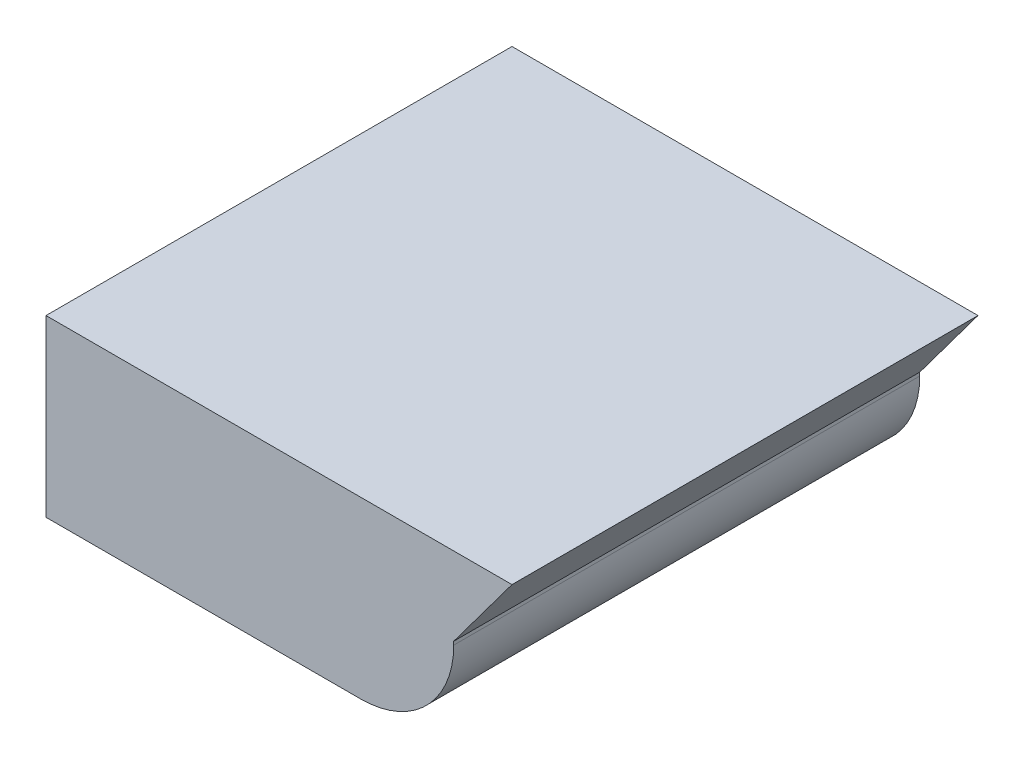
ISO-10303-21;
HEADER;
FILE_DESCRIPTION(('STEP AP214'),'2;1');
FILE_NAME('part.step','',(''),(''),'','','');
FILE_SCHEMA(('AUTOMOTIVE_DESIGN { 1 0 10303 214 1 1 1 1 }'));
ENDSEC;
DATA;
#1=APPLICATION_CONTEXT('core data for automotive mechanical design processes');
#2=APPLICATION_PROTOCOL_DEFINITION('international standard','automotive_design',2000,#1);
#3=PRODUCT_CONTEXT('',#1,'mechanical');
#4=PRODUCT('Part','Part','',(#3));
#5=PRODUCT_RELATED_PRODUCT_CATEGORY('part','',(#4));
#6=PRODUCT_DEFINITION_FORMATION('','',#4);
#7=PRODUCT_DEFINITION_CONTEXT('part definition',#1,'design');
#8=PRODUCT_DEFINITION('design','',#6,#7);
#9=PRODUCT_DEFINITION_SHAPE('','',#8);
#10=(LENGTH_UNIT() NAMED_UNIT(*) SI_UNIT(.MILLI.,.METRE.));
#11=(NAMED_UNIT(*) PLANE_ANGLE_UNIT() SI_UNIT($,.RADIAN.));
#12=(NAMED_UNIT(*) SI_UNIT($,.STERADIAN.) SOLID_ANGLE_UNIT());
#13=UNCERTAINTY_MEASURE_WITH_UNIT(LENGTH_MEASURE(1.E-05),#10,'distance_accuracy_value','');
#14=(GEOMETRIC_REPRESENTATION_CONTEXT(3) GLOBAL_UNCERTAINTY_ASSIGNED_CONTEXT((#13)) GLOBAL_UNIT_ASSIGNED_CONTEXT((#10,
#11,#12)) REPRESENTATION_CONTEXT('',''));
#15=CARTESIAN_POINT('',(0.,0.,0.));
#16=DIRECTION('',(0.,0.,1.));
#17=DIRECTION('',(1.,0.,0.));
#18=AXIS2_PLACEMENT_3D('',#15,#16,#17);
#19=CARTESIAN_POINT('',(13.2318514460255,-82.8660745039792,40.));
#20=DIRECTION('',(0.,0.,-1.));
#21=DIRECTION('',(-1.,0.,0.));
#22=AXIS2_PLACEMENT_3D('',#19,#20,#21);
#23=CYLINDRICAL_SURFACE('',#22,8.);
#24=DIRECTION('',(0.,0.,-1.));
#25=VECTOR('',#24,1.);
#26=CARTESIAN_POINT('',(21.2318514460255,-82.8660745039792,40.));
#27=LINE('',#26,#25);
#28=CARTESIAN_POINT('',(21.2318514460255,-82.8660745039792,40.));
#29=VERTEX_POINT('',#28);
#30=CARTESIAN_POINT('',(21.2318514460255,-82.8660745039792,0.));
#31=VERTEX_POINT('',#30);
#32=EDGE_CURVE('E116',#29,#31,#27,.T.);
#33=ORIENTED_EDGE('',*,*,#32,.F.);
#34=CARTESIAN_POINT('',(13.2318514460255,-82.8660745039792,40.));
#35=DIRECTION('',(0.,0.,-1.));
#36=DIRECTION('',(-1.,0.,0.));
#37=AXIS2_PLACEMENT_3D('',#34,#35,#36);
#38=CIRCLE('',#37,8.);
#39=CARTESIAN_POINT('',(13.2318514460255,-90.8660745039792,40.));
#40=VERTEX_POINT('',#39);
#41=EDGE_CURVE('E47',#40,#29,#38,.F.);
#42=ORIENTED_EDGE('',*,*,#41,.F.);
#43=DIRECTION('',(0.,0.,-1.));
#44=VECTOR('',#43,1.);
#45=CARTESIAN_POINT('',(13.2318514460255,-90.8660745039792,40.));
#46=LINE('',#45,#44);
#47=CARTESIAN_POINT('',(13.2318514460255,-90.8660745039792,0.));
#48=VERTEX_POINT('',#47);
#49=EDGE_CURVE('E96',#48,#40,#46,.F.);
#50=ORIENTED_EDGE('',*,*,#49,.F.);
#51=CARTESIAN_POINT('',(13.2318514460255,-82.8660745039792,0.));
#52=DIRECTION('',(0.,0.,-1.));
#53=DIRECTION('',(-1.,0.,0.));
#54=AXIS2_PLACEMENT_3D('',#51,#52,#53);
#55=CIRCLE('',#54,8.);
#56=EDGE_CURVE('E11',#31,#48,#55,.T.);
#57=ORIENTED_EDGE('',*,*,#56,.F.);
#58=EDGE_LOOP('',(#33,#42,#50,#57));
#59=FACE_BOUND('',#58,.T.);
#60=ADVANCED_FACE('F39',(#59),#23,.T.);
#61=CARTESIAN_POINT('',(-13.7681485539745,-90.8660745039792,40.));
#62=DIRECTION('',(1.,0.,0.));
#63=DIRECTION('',(0.,0.,-1.));
#64=AXIS2_PLACEMENT_3D('',#61,#62,#63);
#65=PLANE('',#64);
#66=DIRECTION('',(0.,-1.,0.));
#67=VECTOR('',#66,1.);
#68=CARTESIAN_POINT('',(-13.7681485539745,-90.8660745039792,0.));
#69=LINE('',#68,#67);
#70=CARTESIAN_POINT('',(-13.7681485539745,-75.8660745039792,0.));
#71=VERTEX_POINT('',#70);
#72=CARTESIAN_POINT('',(-13.7681485539745,-90.8660745039792,0.));
#73=VERTEX_POINT('',#72);
#74=EDGE_CURVE('E114',#71,#73,#69,.T.);
#75=ORIENTED_EDGE('',*,*,#74,.T.);
#76=DIRECTION('',(0.,0.,-1.));
#77=VECTOR('',#76,1.);
#78=CARTESIAN_POINT('',(-13.7681485539745,-90.8660745039792,40.));
#79=LINE('',#78,#77);
#80=CARTESIAN_POINT('',(-13.7681485539745,-90.8660745039792,40.));
#81=VERTEX_POINT('',#80);
#82=EDGE_CURVE('E94',#81,#73,#79,.T.);
#83=ORIENTED_EDGE('',*,*,#82,.F.);
#84=DIRECTION('',(0.,-1.,0.));
#85=VECTOR('',#84,1.);
#86=CARTESIAN_POINT('',(-13.7681485539745,-90.8660745039792,40.));
#87=LINE('',#86,#85);
#88=CARTESIAN_POINT('',(-13.7681485539745,-75.8660745039792,40.));
#89=VERTEX_POINT('',#88);
#90=EDGE_CURVE('E100',#89,#81,#87,.T.);
#91=ORIENTED_EDGE('',*,*,#90,.F.);
#92=DIRECTION('',(0.,0.,-1.));
#93=VECTOR('',#92,1.);
#94=CARTESIAN_POINT('',(-13.7681485539745,-75.8660745039792,40.));
#95=LINE('',#94,#93);
#96=EDGE_CURVE('E143',#89,#71,#95,.T.);
#97=ORIENTED_EDGE('',*,*,#96,.T.);
#98=EDGE_LOOP('',(#75,#83,#91,#97));
#99=FACE_BOUND('',#98,.T.);
#100=ADVANCED_FACE('F112',(#99),#65,.F.);
#101=CARTESIAN_POINT('',(21.2318514460255,-90.8660745039792,40.));
#102=DIRECTION('',(0.,1.,0.));
#103=DIRECTION('',(-1.,0.,0.));
#104=AXIS2_PLACEMENT_3D('',#101,#102,#103);
#105=PLANE('',#104);
#106=DIRECTION('',(1.,0.,0.));
#107=VECTOR('',#106,1.);
#108=CARTESIAN_POINT('',(21.2318514460255,-90.8660745039792,0.));
#109=LINE('',#108,#107);
#110=EDGE_CURVE('E146',#73,#48,#109,.T.);
#111=ORIENTED_EDGE('',*,*,#110,.T.);
#112=ORIENTED_EDGE('',*,*,#49,.T.);
#113=DIRECTION('',(1.,0.,0.));
#114=VECTOR('',#113,1.);
#115=CARTESIAN_POINT('',(21.2318514460255,-90.8660745039792,40.));
#116=LINE('',#115,#114);
#117=EDGE_CURVE('E89',#81,#40,#116,.T.);
#118=ORIENTED_EDGE('',*,*,#117,.F.);
#119=ORIENTED_EDGE('',*,*,#82,.T.);
#120=EDGE_LOOP('',(#111,#112,#118,#119));
#121=FACE_BOUND('',#120,.T.);
#122=ADVANCED_FACE('F92',(#121),#105,.F.);
#123=CARTESIAN_POINT('',(21.2318514460255,-82.5752431483108,40.));
#124=DIRECTION('',(-1.,0.,0.));
#125=DIRECTION('',(0.,0.,1.));
#126=AXIS2_PLACEMENT_3D('',#123,#124,#125);
#127=PLANE('',#126);
#128=DIRECTION('',(0.,1.,0.));
#129=VECTOR('',#128,1.);
#130=CARTESIAN_POINT('',(21.2318514460255,-82.5752431483108,40.));
#131=LINE('',#130,#129);
#132=CARTESIAN_POINT('',(21.2318514460255,-82.5752431483108,40.));
#133=VERTEX_POINT('',#132);
#134=EDGE_CURVE('E99',#29,#133,#131,.T.);
#135=ORIENTED_EDGE('',*,*,#134,.F.);
#136=ORIENTED_EDGE('',*,*,#32,.T.);
#137=DIRECTION('',(0.,1.,0.));
#138=VECTOR('',#137,1.);
#139=CARTESIAN_POINT('',(21.2318514460255,-82.5752431483108,0.));
#140=LINE('',#139,#138);
#141=CARTESIAN_POINT('',(21.2318514460255,-82.5752431483108,0.));
#142=VERTEX_POINT('',#141);
#143=EDGE_CURVE('E149',#31,#142,#140,.T.);
#144=ORIENTED_EDGE('',*,*,#143,.T.);
#145=DIRECTION('',(0.,0.,-1.));
#146=VECTOR('',#145,1.);
#147=CARTESIAN_POINT('',(21.2318514460255,-82.5752431483108,40.));
#148=LINE('',#147,#146);
#149=EDGE_CURVE('E117',#133,#142,#148,.T.);
#150=ORIENTED_EDGE('',*,*,#149,.F.);
#151=EDGE_LOOP('',(#135,#136,#144,#150));
#152=FACE_BOUND('',#151,.T.);
#153=ADVANCED_FACE('F133',(#152),#127,.F.);
#154=CARTESIAN_POINT('',(26.2318514460255,-75.8660745039792,40.));
#155=DIRECTION('',(-0.801824900426544,0.597559059052713,0.));
#156=DIRECTION('',(-0.597559059052713,-0.801824900426544,0.));
#157=AXIS2_PLACEMENT_3D('',#154,#155,#156);
#158=PLANE('',#157);
#159=DIRECTION('',(0.597559059052713,0.801824900426544,0.));
#160=VECTOR('',#159,1.);
#161=CARTESIAN_POINT('',(26.2318514460255,-75.8660745039792,0.));
#162=LINE('',#161,#160);
#163=CARTESIAN_POINT('',(26.2318514460255,-75.8660745039792,0.));
#164=VERTEX_POINT('',#163);
#165=EDGE_CURVE('E152',#142,#164,#162,.T.);
#166=ORIENTED_EDGE('',*,*,#165,.T.);
#167=DIRECTION('',(0.,0.,-1.));
#168=VECTOR('',#167,1.);
#169=CARTESIAN_POINT('',(26.2318514460255,-75.8660745039792,40.));
#170=LINE('',#169,#168);
#171=CARTESIAN_POINT('',(26.2318514460255,-75.8660745039792,40.));
#172=VERTEX_POINT('',#171);
#173=EDGE_CURVE('E124',#172,#164,#170,.T.);
#174=ORIENTED_EDGE('',*,*,#173,.F.);
#175=DIRECTION('',(0.597559059052713,0.801824900426544,0.));
#176=VECTOR('',#175,1.);
#177=CARTESIAN_POINT('',(26.2318514460255,-75.8660745039792,40.));
#178=LINE('',#177,#176);
#179=EDGE_CURVE('E136',#133,#172,#178,.T.);
#180=ORIENTED_EDGE('',*,*,#179,.F.);
#181=ORIENTED_EDGE('',*,*,#149,.T.);
#182=EDGE_LOOP('',(#166,#174,#180,#181));
#183=FACE_BOUND('',#182,.T.);
#184=ADVANCED_FACE('F167',(#183),#158,.F.);
#185=CARTESIAN_POINT('',(-13.7681485539745,-75.8660745039792,40.));
#186=DIRECTION('',(0.,-1.,0.));
#187=DIRECTION('',(0.,0.,-1.));
#188=AXIS2_PLACEMENT_3D('',#185,#186,#187);
#189=PLANE('',#188);
#190=DIRECTION('',(-1.,0.,0.));
#191=VECTOR('',#190,1.);
#192=CARTESIAN_POINT('',(-13.7681485539745,-75.8660745039792,0.));
#193=LINE('',#192,#191);
#194=EDGE_CURVE('E110',#164,#71,#193,.T.);
#195=ORIENTED_EDGE('',*,*,#194,.T.);
#196=ORIENTED_EDGE('',*,*,#96,.F.);
#197=DIRECTION('',(-1.,0.,0.));
#198=VECTOR('',#197,1.);
#199=CARTESIAN_POINT('',(-13.7681485539745,-75.8660745039792,40.));
#200=LINE('',#199,#198);
#201=EDGE_CURVE('E105',#172,#89,#200,.T.);
#202=ORIENTED_EDGE('',*,*,#201,.F.);
#203=ORIENTED_EDGE('',*,*,#173,.T.);
#204=EDGE_LOOP('',(#195,#196,#202,#203));
#205=FACE_BOUND('',#204,.T.);
#206=ADVANCED_FACE('F163',(#205),#189,.F.);
#207=CARTESIAN_POINT('',(0.,0.,40.));
#208=DIRECTION('',(0.,0.,-1.));
#209=DIRECTION('',(-1.,0.,0.));
#210=AXIS2_PLACEMENT_3D('',#207,#208,#209);
#211=PLANE('',#210);
#212=ORIENTED_EDGE('',*,*,#117,.T.);
#213=ORIENTED_EDGE('',*,*,#41,.T.);
#214=ORIENTED_EDGE('',*,*,#134,.T.);
#215=ORIENTED_EDGE('',*,*,#179,.T.);
#216=ORIENTED_EDGE('',*,*,#201,.T.);
#217=ORIENTED_EDGE('',*,*,#90,.T.);
#218=EDGE_LOOP('',(#212,#213,#214,#215,#216,#217));
#219=FACE_BOUND('',#218,.T.);
#220=ADVANCED_FACE('F103',(#219),#211,.F.);
#221=CARTESIAN_POINT('',(0.,0.,0.));
#222=DIRECTION('',(0.,0.,-1.));
#223=DIRECTION('',(-1.,0.,0.));
#224=AXIS2_PLACEMENT_3D('',#221,#222,#223);
#225=PLANE('',#224);
#226=ORIENTED_EDGE('',*,*,#143,.F.);
#227=ORIENTED_EDGE('',*,*,#56,.T.);
#228=ORIENTED_EDGE('',*,*,#110,.F.);
#229=ORIENTED_EDGE('',*,*,#74,.F.);
#230=ORIENTED_EDGE('',*,*,#194,.F.);
#231=ORIENTED_EDGE('',*,*,#165,.F.);
#232=EDGE_LOOP('',(#226,#227,#228,#229,#230,#231));
#233=FACE_BOUND('',#232,.T.);
#234=ADVANCED_FACE('F166',(#233),#225,.T.);
#235=CLOSED_SHELL('',(#60,#100,#122,#153,#184,#206,#220,#234));
#236=MANIFOLD_SOLID_BREP('B2',#235);
#237=ADVANCED_BREP_SHAPE_REPRESENTATION('',(#18,#236),#14);
#238=SHAPE_DEFINITION_REPRESENTATION(#9,#237);
ENDSEC;
END-ISO-10303-21;
